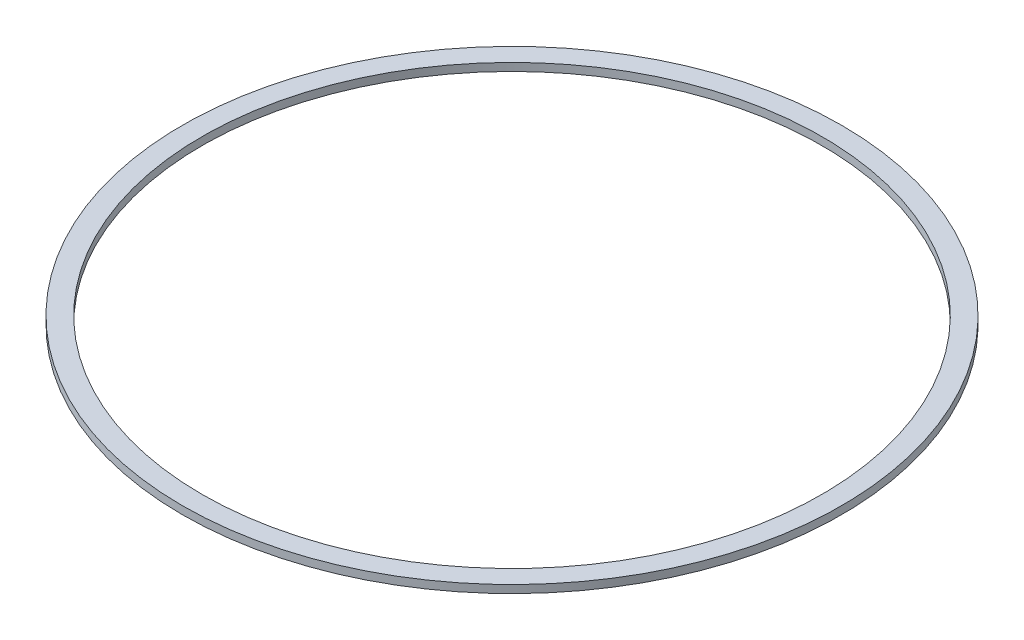
ISO-10303-21;
HEADER;
FILE_DESCRIPTION(('STEP AP214'),'2;1');
FILE_NAME('part.step','',(''),(''),'','','');
FILE_SCHEMA(('AUTOMOTIVE_DESIGN { 1 0 10303 214 1 1 1 1 }'));
ENDSEC;
DATA;
#1=APPLICATION_CONTEXT('core data for automotive mechanical design processes');
#2=APPLICATION_PROTOCOL_DEFINITION('international standard','automotive_design',2000,#1);
#3=PRODUCT_CONTEXT('',#1,'mechanical');
#4=PRODUCT('Part','Part','',(#3));
#5=PRODUCT_RELATED_PRODUCT_CATEGORY('part','',(#4));
#6=PRODUCT_DEFINITION_FORMATION('','',#4);
#7=PRODUCT_DEFINITION_CONTEXT('part definition',#1,'design');
#8=PRODUCT_DEFINITION('design','',#6,#7);
#9=PRODUCT_DEFINITION_SHAPE('','',#8);
#10=(LENGTH_UNIT() NAMED_UNIT(*) SI_UNIT(.MILLI.,.METRE.));
#11=(NAMED_UNIT(*) PLANE_ANGLE_UNIT() SI_UNIT($,.RADIAN.));
#12=(NAMED_UNIT(*) SI_UNIT($,.STERADIAN.) SOLID_ANGLE_UNIT());
#13=UNCERTAINTY_MEASURE_WITH_UNIT(LENGTH_MEASURE(1.E-05),#10,'distance_accuracy_value','');
#14=(GEOMETRIC_REPRESENTATION_CONTEXT(3) GLOBAL_UNCERTAINTY_ASSIGNED_CONTEXT((#13)) GLOBAL_UNIT_ASSIGNED_CONTEXT((#10,
#11,#12)) REPRESENTATION_CONTEXT('',''));
#15=CARTESIAN_POINT('',(0.,0.,0.));
#16=DIRECTION('',(0.,0.,1.));
#17=DIRECTION('',(1.,0.,0.));
#18=AXIS2_PLACEMENT_3D('',#15,#16,#17);
#19=CARTESIAN_POINT('',(0.,1.,0.));
#20=DIRECTION('',(0.,1.,0.));
#21=DIRECTION('',(0.,0.,1.));
#22=AXIS2_PLACEMENT_3D('',#19,#20,#21);
#23=PLANE('',#22);
#24=CARTESIAN_POINT('',(0.,1.,0.));
#25=DIRECTION('',(0.,1.,0.));
#26=DIRECTION('',(0.,0.,1.));
#27=AXIS2_PLACEMENT_3D('',#24,#25,#26);
#28=CIRCLE('',#27,42.);
#29=CARTESIAN_POINT('',(0.,1.,42.));
#30=VERTEX_POINT('',#29);
#31=EDGE_CURVE('E10',#30,#30,#28,.T.);
#32=ORIENTED_EDGE('',*,*,#31,.T.);
#33=EDGE_LOOP('',(#32));
#34=FACE_BOUND('',#33,.T.);
#35=CARTESIAN_POINT('',(0.,1.,0.));
#36=DIRECTION('',(0.,1.,0.));
#37=DIRECTION('',(0.,0.,1.));
#38=AXIS2_PLACEMENT_3D('',#35,#36,#37);
#39=CIRCLE('',#38,39.5);
#40=CARTESIAN_POINT('',(0.,1.,39.5));
#41=VERTEX_POINT('',#40);
#42=EDGE_CURVE('E42',#41,#41,#39,.T.);
#43=ORIENTED_EDGE('',*,*,#42,.F.);
#44=EDGE_LOOP('',(#43));
#45=FACE_BOUND('',#44,.T.);
#46=ADVANCED_FACE('F31',(#34,#45),#23,.T.);
#47=CARTESIAN_POINT('',(0.,0.,0.));
#48=DIRECTION('',(0.,1.,0.));
#49=DIRECTION('',(0.,0.,1.));
#50=AXIS2_PLACEMENT_3D('',#47,#48,#49);
#51=PLANE('',#50);
#52=CARTESIAN_POINT('',(0.,0.,0.));
#53=DIRECTION('',(0.,1.,0.));
#54=DIRECTION('',(0.,0.,1.));
#55=AXIS2_PLACEMENT_3D('',#52,#53,#54);
#56=CIRCLE('',#55,42.);
#57=CARTESIAN_POINT('',(0.,0.,42.));
#58=VERTEX_POINT('',#57);
#59=EDGE_CURVE('E35',#58,#58,#56,.T.);
#60=ORIENTED_EDGE('',*,*,#59,.F.);
#61=EDGE_LOOP('',(#60));
#62=FACE_BOUND('',#61,.T.);
#63=CARTESIAN_POINT('',(0.,0.,0.));
#64=DIRECTION('',(0.,1.,0.));
#65=DIRECTION('',(0.,0.,1.));
#66=AXIS2_PLACEMENT_3D('',#63,#64,#65);
#67=CIRCLE('',#66,39.5);
#68=CARTESIAN_POINT('',(0.,0.,39.5));
#69=VERTEX_POINT('',#68);
#70=EDGE_CURVE('E44',#69,#69,#67,.T.);
#71=ORIENTED_EDGE('',*,*,#70,.T.);
#72=EDGE_LOOP('',(#71));
#73=FACE_BOUND('',#72,.T.);
#74=ADVANCED_FACE('F54',(#62,#73),#51,.F.);
#75=CARTESIAN_POINT('',(0.,1.,0.));
#76=DIRECTION('',(0.,-1.,0.));
#77=DIRECTION('',(0.,0.,-1.));
#78=AXIS2_PLACEMENT_3D('',#75,#76,#77);
#79=CYLINDRICAL_SURFACE('',#78,42.);
#80=ORIENTED_EDGE('',*,*,#31,.F.);
#81=EDGE_LOOP('',(#80));
#82=FACE_BOUND('',#81,.T.);
#83=ORIENTED_EDGE('',*,*,#59,.T.);
#84=EDGE_LOOP('',(#83));
#85=FACE_BOUND('',#84,.T.);
#86=ADVANCED_FACE('F33',(#82,#85),#79,.T.);
#87=CARTESIAN_POINT('',(0.,1.,0.));
#88=DIRECTION('',(0.,-1.,0.));
#89=DIRECTION('',(0.,0.,-1.));
#90=AXIS2_PLACEMENT_3D('',#87,#88,#89);
#91=CYLINDRICAL_SURFACE('',#90,39.5);
#92=ORIENTED_EDGE('',*,*,#42,.T.);
#93=EDGE_LOOP('',(#92));
#94=FACE_BOUND('',#93,.T.);
#95=ORIENTED_EDGE('',*,*,#70,.F.);
#96=EDGE_LOOP('',(#95));
#97=FACE_BOUND('',#96,.T.);
#98=ADVANCED_FACE('F50',(#94,#97),#91,.F.);
#99=CLOSED_SHELL('',(#46,#74,#86,#98));
#100=MANIFOLD_SOLID_BREP('B2',#99);
#101=ADVANCED_BREP_SHAPE_REPRESENTATION('',(#18,#100),#14);
#102=SHAPE_DEFINITION_REPRESENTATION(#9,#101);
ENDSEC;
END-ISO-10303-21;
